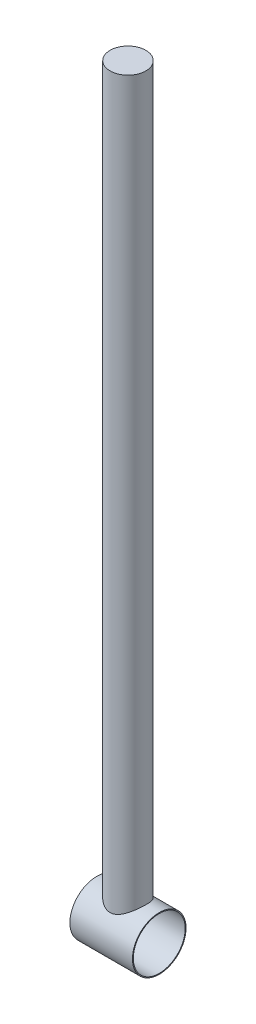
ISO-10303-21;
HEADER;
FILE_DESCRIPTION(('STEP AP214'),'2;1');
FILE_NAME('part.step','',(''),(''),'','','');
FILE_SCHEMA(('AUTOMOTIVE_DESIGN { 1 0 10303 214 1 1 1 1 }'));
ENDSEC;
DATA;
#1=APPLICATION_CONTEXT('core data for automotive mechanical design processes');
#2=APPLICATION_PROTOCOL_DEFINITION('international standard','automotive_design',2000,#1);
#3=PRODUCT_CONTEXT('',#1,'mechanical');
#4=PRODUCT('Part','Part','',(#3));
#5=PRODUCT_RELATED_PRODUCT_CATEGORY('part','',(#4));
#6=PRODUCT_DEFINITION_FORMATION('','',#4);
#7=PRODUCT_DEFINITION_CONTEXT('part definition',#1,'design');
#8=PRODUCT_DEFINITION('design','',#6,#7);
#9=PRODUCT_DEFINITION_SHAPE('','',#8);
#10=(LENGTH_UNIT() NAMED_UNIT(*) SI_UNIT(.MILLI.,.METRE.));
#11=(NAMED_UNIT(*) PLANE_ANGLE_UNIT() SI_UNIT($,.RADIAN.));
#12=(NAMED_UNIT(*) SI_UNIT($,.STERADIAN.) SOLID_ANGLE_UNIT());
#13=UNCERTAINTY_MEASURE_WITH_UNIT(LENGTH_MEASURE(1.E-05),#10,'distance_accuracy_value','');
#14=(GEOMETRIC_REPRESENTATION_CONTEXT(3) GLOBAL_UNCERTAINTY_ASSIGNED_CONTEXT((#13)) GLOBAL_UNIT_ASSIGNED_CONTEXT((#10,
#11,#12)) REPRESENTATION_CONTEXT('',''));
#15=CARTESIAN_POINT('',(0.,0.,0.));
#16=DIRECTION('',(0.,0.,1.));
#17=DIRECTION('',(1.,0.,0.));
#18=AXIS2_PLACEMENT_3D('',#15,#16,#17);
#19=CARTESIAN_POINT('',(35.,0.,0.));
#20=DIRECTION('',(1.,0.,0.));
#21=DIRECTION('',(0.,0.,-1.));
#22=AXIS2_PLACEMENT_3D('',#19,#20,#21);
#23=PLANE('',#22);
#24=CARTESIAN_POINT('',(35.,0.,0.));
#25=DIRECTION('',(1.,0.,0.));
#26=DIRECTION('',(0.,0.,-1.));
#27=AXIS2_PLACEMENT_3D('',#24,#25,#26);
#28=CIRCLE('',#27,30.);
#29=CARTESIAN_POINT('',(35.,0.,-30.));
#30=VERTEX_POINT('',#29);
#31=EDGE_CURVE('E10',#30,#30,#28,.T.);
#32=ORIENTED_EDGE('',*,*,#31,.T.);
#33=EDGE_LOOP('',(#32));
#34=FACE_BOUND('',#33,.T.);
#35=CARTESIAN_POINT('',(35.,0.,0.));
#36=DIRECTION('',(1.,0.,0.));
#37=DIRECTION('',(0.,0.,-1.));
#38=AXIS2_PLACEMENT_3D('',#35,#36,#37);
#39=CIRCLE('',#38,29.);
#40=CARTESIAN_POINT('',(35.,0.,-29.));
#41=VERTEX_POINT('',#40);
#42=EDGE_CURVE('E43',#41,#41,#39,.T.);
#43=ORIENTED_EDGE('',*,*,#42,.F.);
#44=EDGE_LOOP('',(#43));
#45=FACE_BOUND('',#44,.T.);
#46=ADVANCED_FACE('F32',(#34,#45),#23,.T.);
#47=CARTESIAN_POINT('',(-35.,0.,0.));
#48=DIRECTION('',(1.,0.,0.));
#49=DIRECTION('',(0.,0.,-1.));
#50=AXIS2_PLACEMENT_3D('',#47,#48,#49);
#51=PLANE('',#50);
#52=CARTESIAN_POINT('',(-35.,0.,0.));
#53=DIRECTION('',(1.,0.,0.));
#54=DIRECTION('',(0.,0.,-1.));
#55=AXIS2_PLACEMENT_3D('',#52,#53,#54);
#56=CIRCLE('',#55,30.);
#57=CARTESIAN_POINT('',(-35.,0.,-30.));
#58=VERTEX_POINT('',#57);
#59=EDGE_CURVE('E36',#58,#58,#56,.T.);
#60=ORIENTED_EDGE('',*,*,#59,.F.);
#61=EDGE_LOOP('',(#60));
#62=FACE_BOUND('',#61,.T.);
#63=CARTESIAN_POINT('',(-35.,0.,0.));
#64=DIRECTION('',(1.,0.,0.));
#65=DIRECTION('',(0.,0.,-1.));
#66=AXIS2_PLACEMENT_3D('',#63,#64,#65);
#67=CIRCLE('',#66,29.);
#68=CARTESIAN_POINT('',(-35.,0.,-29.));
#69=VERTEX_POINT('',#68);
#70=EDGE_CURVE('E45',#69,#69,#67,.T.);
#71=ORIENTED_EDGE('',*,*,#70,.T.);
#72=EDGE_LOOP('',(#71));
#73=FACE_BOUND('',#72,.T.);
#74=ADVANCED_FACE('F75',(#62,#73),#51,.F.);
#75=CARTESIAN_POINT('',(35.,0.,0.));
#76=DIRECTION('',(-1.,0.,0.));
#77=DIRECTION('',(0.,0.,1.));
#78=AXIS2_PLACEMENT_3D('',#75,#76,#77);
#79=CYLINDRICAL_SURFACE('',#78,30.);
#80=CARTESIAN_POINT('',(0.,22.3606797749979,20.));
#81=CARTESIAN_POINT('',(0.488208956169302,22.3606858935288,19.9999964119226));
#82=CARTESIAN_POINT('',(0.976468291774058,22.3767415723571,19.9820866285813));
#83=CARTESIAN_POINT('',(1.94835881250643,22.4401594085095,19.9108373861768));
#84=CARTESIAN_POINT('',(2.43198924712352,22.4875265581483,19.8574922772833));
#85=CARTESIAN_POINT('',(3.39112332136817,22.6113496939203,19.7163799196857));
#86=CARTESIAN_POINT('',(3.8666135294044,22.6878496694561,19.6285606101056));
#87=CARTESIAN_POINT('',(4.80533737323533,22.8665434498395,19.4200919600602));
#88=CARTESIAN_POINT('',(5.26857077190595,22.9687377513765,19.2994419849513));
#89=CARTESIAN_POINT('',(6.17578513914899,23.193728226989,19.0284426273943));
#90=CARTESIAN_POINT('',(6.6199111296105,23.3163108203906,18.8783985352891));
#91=CARTESIAN_POINT('',(7.49212487931457,23.5787801839215,18.5495380856482));
#92=CARTESIAN_POINT('',(7.92020999413462,23.7186697909934,18.3707170095788));
#93=CARTESIAN_POINT('',(8.75912421482544,24.0118255935988,17.9858478768931));
#94=CARTESIAN_POINT('',(9.16995442032433,24.1650909347959,17.7798015587787));
#95=CARTESIAN_POINT('',(9.97362051230805,24.4813525241294,17.3417522052945));
#96=CARTESIAN_POINT('',(10.3664551510918,24.644349445194,17.1097473739498));
#97=CARTESIAN_POINT('',(11.1932268211757,25.00257367896,16.5827611461459));
#98=CARTESIAN_POINT('',(11.6240409428177,25.1988679806497,16.2835985891376));
#99=CARTESIAN_POINT('',(12.4598274059487,25.5951544496233,15.6533280846079));
#100=CARTESIAN_POINT('',(12.8647979980787,25.7951468660549,15.3222179783466));
#101=CARTESIAN_POINT('',(13.6481434866574,26.194621993879,14.6288076134715));
#102=CARTESIAN_POINT('',(14.0264936382841,26.3941040691864,14.2664790139786));
#103=CARTESIAN_POINT('',(14.7548145893199,26.788258639696,13.5118632099609));
#104=CARTESIAN_POINT('',(15.1047834311923,26.9829308025026,13.1195739425843));
#105=CARTESIAN_POINT('',(15.8231340954399,27.3910931463656,12.2471310095378));
#106=CARTESIAN_POINT('',(16.1868495528045,27.6032288530363,11.7624780965832));
#107=CARTESIAN_POINT('',(16.8717372344808,28.0103500677694,10.7570654072488));
#108=CARTESIAN_POINT('',(17.1929043262227,28.2053335058183,10.2363012863295));
#109=CARTESIAN_POINT('',(17.7887598687195,28.5724511444835,9.1617184714881));
#110=CARTESIAN_POINT('',(18.0634871779264,28.7446044219641,8.60792794262454));
#111=CARTESIAN_POINT('',(18.5627727588207,29.0609568759301,7.4705384998476));
#112=CARTESIAN_POINT('',(18.7873417767955,29.205162039351,6.88694600391358));
#113=CARTESIAN_POINT('',(19.1602240381012,29.4464999554022,5.76165832972233));
#114=CARTESIAN_POINT('',(19.3142641521887,29.5470977395677,5.22260227045826));
#115=CARTESIAN_POINT('',(19.5772038937651,29.7196407127317,4.12906673821278));
#116=CARTESIAN_POINT('',(19.6861065662819,29.7915878345267,3.57458830833749));
#117=CARTESIAN_POINT('',(19.8566974647913,29.904587508942,2.45588842993637));
#118=CARTESIAN_POINT('',(19.9184351137685,29.9456724005222,1.89167781543662));
#119=CARTESIAN_POINT('',(19.9936647349202,29.9957633041667,0.7586590887696));
#120=CARTESIAN_POINT('',(20.007163514351,30.0047738424215,0.189851636642885));
#121=CARTESIAN_POINT('',(19.9873184370662,29.9915473981852,-0.859806415927934));
#122=CARTESIAN_POINT('',(19.9607940358833,29.9738593639155,-1.34086232409546));
#123=CARTESIAN_POINT('',(19.873310019839,29.9156709892741,-2.2983895351906));
#124=CARTESIAN_POINT('',(19.8123548499873,29.8751735935912,-2.7748614218412));
#125=CARTESIAN_POINT('',(19.6568520909165,29.7722764488344,-3.7198828753724));
#126=CARTESIAN_POINT('',(19.5623030441721,29.7098757494512,-4.18843209759108));
#127=CARTESIAN_POINT('',(19.3408382238798,29.5645234505635,-5.11455664152083));
#128=CARTESIAN_POINT('',(19.2139210515152,29.4815709628999,-5.57213148802944));
#129=CARTESIAN_POINT('',(18.9298040334638,29.2971987002846,-6.47179810816159));
#130=CARTESIAN_POINT('',(18.7727295883957,29.1958554904912,-6.91394533614488));
#131=CARTESIAN_POINT('',(18.4296096664266,28.9764235265008,-7.78251525709052));
#132=CARTESIAN_POINT('',(18.2435647019401,28.858335068488,-8.20893822800989));
#133=CARTESIAN_POINT('',(17.8441778455769,28.6075257726395,-9.04431763466509));
#134=CARTESIAN_POINT('',(17.6308352556287,28.4748045606182,-9.45327362336785));
#135=CARTESIAN_POINT('',(17.1784769804029,28.1969539999433,-10.2523545489443));
#136=CARTESIAN_POINT('',(16.9394582795807,28.0518231942476,-10.6424772661187));
#137=CARTESIAN_POINT('',(16.4042840153249,27.7317267401802,-11.4527356062426));
#138=CARTESIAN_POINT('',(16.1047473885238,27.5553463717531,-11.8700812163928));
#139=CARTESIAN_POINT('',(15.4767499308217,27.1930871485775,-12.6780149842778));
#140=CARTESIAN_POINT('',(15.1482869484778,27.007207587744,-13.0686011478891));
#141=CARTESIAN_POINT('',(14.463625347029,26.6292105400492,-13.8225619123957));
#142=CARTESIAN_POINT('',(14.107387635318,26.4370844912714,-14.185896693865));
#143=CARTESIAN_POINT('',(13.3689696755022,26.0505351068054,-14.883843396687));
#144=CARTESIAN_POINT('',(12.9867881329827,25.8561116568934,-15.2184538830105));
#145=CARTESIAN_POINT('',(12.1362208652914,25.4387487342262,-15.9077512722913));
#146=CARTESIAN_POINT('',(11.6636681752519,25.2160728404677,-16.2574779985587));
#147=CARTESIAN_POINT('',(10.6867448691347,24.7793365815512,-16.9156894234147));
#148=CARTESIAN_POINT('',(10.1823671315698,24.5652781624035,-17.2241648426867));
#149=CARTESIAN_POINT('',(9.14376134489059,24.1532936665152,-17.7972680129957));
#150=CARTESIAN_POINT('',(8.60957393087465,23.9553464914574,-18.0619535936899));
#151=CARTESIAN_POINT('',(7.78719238261373,23.6764424287916,-18.4241508744694));
#152=CARTESIAN_POINT('',(7.50958963683994,23.586488758667,-18.539064186288));
#153=CARTESIAN_POINT('',(6.94749503984161,23.4135888725702,-18.7569503816948));
#154=CARTESIAN_POINT('',(6.66300152644001,23.3306443694362,-18.8599203489511));
#155=CARTESIAN_POINT('',(5.96407091868975,23.1390114191645,-19.0949737019528));
#156=CARTESIAN_POINT('',(5.54626140545961,23.0345499403737,-19.2205883140043));
#157=CARTESIAN_POINT('',(4.69922231908342,22.8454014192454,-19.4450303060951));
#158=CARTESIAN_POINT('',(4.26999589657128,22.7607089831938,-19.5438649938583));
#159=CARTESIAN_POINT('',(3.40278811100768,22.6140815263718,-19.7133430846625));
#160=CARTESIAN_POINT('',(2.96482019952331,22.5521140132966,-19.78402675084));
#161=CARTESIAN_POINT('',(2.08233638909669,22.4531500088269,-19.8962732778957));
#162=CARTESIAN_POINT('',(1.63782046369869,22.4161536183507,-19.9378360210846));
#163=CARTESIAN_POINT('',(0.743602003114596,22.3685666502113,-19.9912114344644));
#164=CARTESIAN_POINT('',(0.293885240116605,22.3580932385861,-20.0028921020166));
#165=CARTESIAN_POINT('',(-0.605120297999129,22.3643493087133,-19.9958970388908));
#166=CARTESIAN_POINT('',(-1.05440907208809,22.3810788556911,-19.9772212354264));
#167=CARTESIAN_POINT('',(-1.9492428602337,22.4410353821841,-19.9098452800438));
#168=CARTESIAN_POINT('',(-2.39478497674719,22.4842812448844,-19.8611237313693));
#169=CARTESIAN_POINT('',(-3.27854030433162,22.5954993646352,-19.7344995148557));
#170=CARTESIAN_POINT('',(-3.71675339276235,22.6634720350192,-19.6565963592159));
#171=CARTESIAN_POINT('',(-4.56177482159982,22.8176625120601,-19.4773587360434));
#172=CARTESIAN_POINT('',(-4.9690663661839,22.9028156744357,-19.3773687153742));
#173=CARTESIAN_POINT('',(-5.7729769048643,23.0905696500378,-19.1532490632813));
#174=CARTESIAN_POINT('',(-6.16959170710487,23.193177203668,-19.0291101035355));
#175=CARTESIAN_POINT('',(-6.95065639455215,23.4130553221982,-18.7579126655137));
#176=CARTESIAN_POINT('',(-7.33510717762389,23.5303248016759,-18.6108558836455));
#177=CARTESIAN_POINT('',(-8.0910039230564,23.7768089487606,-18.2949037795793));
#178=CARTESIAN_POINT('',(-8.46244798787663,23.9060253493674,-18.1260052876392));
#179=CARTESIAN_POINT('',(-9.26453201163456,24.2005356466709,-17.731501269301));
#180=CARTESIAN_POINT('',(-9.69216720830649,24.3678787987211,-17.5013086005028));
#181=CARTESIAN_POINT('',(-10.5268797585094,24.7117489529602,-17.0123139239897));
#182=CARTESIAN_POINT('',(-10.9339551810086,24.8882768146534,-16.7535092362064));
#183=CARTESIAN_POINT('',(-11.7272393872389,25.246838016415,-16.2081390990384));
#184=CARTESIAN_POINT('',(-12.1134251136209,25.4288771074696,-15.9215439116551));
#185=CARTESIAN_POINT('',(-12.863686505644,25.7947122322757,-15.3217576930428));
#186=CARTESIAN_POINT('',(-13.2277606863969,25.9785083830645,-15.0085648790455));
#187=CARTESIAN_POINT('',(-14.010022924438,26.3845748584298,-14.2850209466698));
#188=CARTESIAN_POINT('',(-14.4226354817809,26.6064699077529,-13.868399953091));
#189=CARTESIAN_POINT('',(-15.2116275793937,27.0422910024591,-12.9981303927617));
#190=CARTESIAN_POINT('',(-15.5880004523266,27.2562155770218,-12.5444750407321));
#191=CARTESIAN_POINT('',(-16.3015809622043,27.6705120036506,-11.6020484650165));
#192=CARTESIAN_POINT('',(-16.6388155779588,27.8708931512095,-11.1133018111967));
#193=CARTESIAN_POINT('',(-17.2712189380549,28.2529916116302,-10.1024838029969));
#194=CARTESIAN_POINT('',(-17.5663989619658,28.4347139253593,-9.58042143890714));
#195=CARTESIAN_POINT('',(-18.0588559388184,28.7418292040784,-8.60898698059616));
#196=CARTESIAN_POINT('',(-18.2640476187588,28.871337394815,-8.16491313347023));
#197=CARTESIAN_POINT('',(-18.6427436665588,29.11237793097,-7.25872966066563));
#198=CARTESIAN_POINT('',(-18.8162516453839,29.2239123246767,-6.79662209756982));
#199=CARTESIAN_POINT('',(-19.1295452645597,29.4266077341683,-5.8570926543953));
#200=CARTESIAN_POINT('',(-19.2693535082187,29.5177824027246,-5.37968128385402));
#201=CARTESIAN_POINT('',(-19.5136219644057,29.6778186712604,-4.41219358714587));
#202=CARTESIAN_POINT('',(-19.6180816641359,29.746679947541,-3.92211707735807));
#203=CARTESIAN_POINT('',(-19.7905605262366,29.8607111976658,-2.93054121015943));
#204=CARTESIAN_POINT('',(-19.8584133272705,29.9057729947659,-2.42900032455899));
#205=CARTESIAN_POINT('',(-19.9559150035461,29.9706058238814,-1.42057881685205));
#206=CARTESIAN_POINT('',(-19.985563818304,29.990376815857,-0.913698186293017));
#207=CARTESIAN_POINT('',(-20.0061827922548,30.0041212399487,0.101169392531049));
#208=CARTESIAN_POINT('',(-19.9971552556599,29.9980962089087,0.6091562730871));
#209=CARTESIAN_POINT('',(-19.9405705458765,29.9604056252688,1.6219998853204));
#210=CARTESIAN_POINT('',(-19.8930151261764,29.9287412395721,2.12685675839747));
#211=CARTESIAN_POINT('',(-19.7649794259347,29.8437985658208,3.09279975247605));
#212=CARTESIAN_POINT('',(-19.687150146037,29.7922629250282,3.55439520403423));
#213=CARTESIAN_POINT('',(-19.5000321223317,29.6689450523963,4.46836902451358));
#214=CARTESIAN_POINT('',(-19.3907452072019,29.597163997457,4.92074792756969));
#215=CARTESIAN_POINT('',(-19.1419956701691,29.4347944617127,5.81367709229976));
#216=CARTESIAN_POINT('',(-19.0025311498945,29.344204797736,6.25422660786602));
#217=CARTESIAN_POINT('',(-18.6949126651676,29.1459419809342,7.12122590088722));
#218=CARTESIAN_POINT('',(-18.5267571866793,29.0382679265783,7.54767493283414));
#219=CARTESIAN_POINT('',(-18.1528283168397,28.8010951909527,8.40878779714676));
#220=CARTESIAN_POINT('',(-17.9454426246028,28.670694888708,8.84250227551099));
#221=CARTESIAN_POINT('',(-17.5022026754717,28.3953682076704,9.69029143409239));
#222=CARTESIAN_POINT('',(-17.2663476127158,28.2504414177065,10.104365557902));
#223=CARTESIAN_POINT('',(-16.7678351398796,27.9485407408145,10.9116855558948));
#224=CARTESIAN_POINT('',(-16.5051663004555,27.7915617237644,11.3049224388242));
#225=CARTESIAN_POINT('',(-15.9547049296104,27.4682178656632,12.0693531593152));
#226=CARTESIAN_POINT('',(-15.6669095826824,27.3018519735229,12.4405445187535));
#227=CARTESIAN_POINT('',(-15.0204704992175,26.9357159197241,13.2166207315212));
#228=CARTESIAN_POINT('',(-14.6578028483683,26.7348072575091,13.6176230440809));
#229=CARTESIAN_POINT('',(-13.9025385930368,26.3282976577339,14.3878567191196));
#230=CARTESIAN_POINT('',(-13.5099380886709,26.1226961112019,14.757083928306));
#231=CARTESIAN_POINT('',(-12.6960054650691,25.7111873767681,15.4629181005339));
#232=CARTESIAN_POINT('',(-12.2746525915669,25.5052800753153,15.7995010665117));
#233=CARTESIAN_POINT('',(-11.4046784566367,25.0981854077811,16.4385088149114));
#234=CARTESIAN_POINT('',(-10.9560598425279,24.8969975860907,16.7409369054171));
#235=CARTESIAN_POINT('',(-10.0678167363029,24.519622725546,17.288437587054));
#236=CARTESIAN_POINT('',(-9.63011792851659,24.3426994009277,17.536125801145));
#237=CARTESIAN_POINT('',(-8.7331555306482,24.0019984692107,17.9996334824726));
#238=CARTESIAN_POINT('',(-8.27389129214839,23.838221257784,18.2154519906584));
#239=CARTESIAN_POINT('',(-7.33576452239174,23.5290813254498,18.6130511835398));
#240=CARTESIAN_POINT('',(-6.8569347106357,23.3836894022856,18.7948860714089));
#241=CARTESIAN_POINT('',(-5.88083845965279,23.1163199010043,19.1227764985235));
#242=CARTESIAN_POINT('',(-5.38357708340433,22.9943359489798,19.268841780706));
#243=CARTESIAN_POINT('',(-4.4853911912487,22.802875861737,19.4947592055363));
#244=CARTESIAN_POINT('',(-4.08754467830019,22.7277543004783,19.5821115045836));
#245=CARTESIAN_POINT('',(-3.28415884670264,22.5970955375622,19.7327455746581));
#246=CARTESIAN_POINT('',(-2.8786207162801,22.541555336465,19.7960310323203));
#247=CARTESIAN_POINT('',(-2.06234621278792,22.4519236803042,19.8976315087765));
#248=CARTESIAN_POINT('',(-1.65161370745007,22.4178171262643,19.9359641063474));
#249=CARTESIAN_POINT('',(-0.827266419755447,22.3721912092578,19.9871514199303));
#250=CARTESIAN_POINT('',(-0.413651293298562,22.3606745908688,20.0000030401181));
#251=CARTESIAN_POINT('',(0.,22.3606797749979,20.));
#252=B_SPLINE_CURVE_WITH_KNOTS('',3,(#80,#81,#82,#83,#84,#85,#86,#87,#88,#89,#90,#91,#92,#93,
#94,#95,#96,#97,#98,#99,#100,#101,#102,#103,#104,#105,#106,#107,#108,#109,#110,#111,#112,#113,
#114,#115,#116,#117,#118,#119,#120,#121,#122,#123,#124,#125,#126,#127,#128,#129,#130,#131,#132,
#133,#134,#135,#136,#137,#138,#139,#140,#141,#142,#143,#144,#145,#146,#147,#148,#149,#150,#151,
#152,#153,#154,#155,#156,#157,#158,#159,#160,#161,#162,#163,#164,#165,#166,#167,#168,#169,#170,
#171,#172,#173,#174,#175,#176,#177,#178,#179,#180,#181,#182,#183,#184,#185,#186,#187,#188,#189,
#190,#191,#192,#193,#194,#195,#196,#197,#198,#199,#200,#201,#202,#203,#204,#205,#206,#207,#208,
#209,#210,#211,#212,#213,#214,#215,#216,#217,#218,#219,#220,#221,#222,#223,#224,#225,#226,#227,
#228,#229,#230,#231,#232,#233,#234,#235,#236,#237,#238,#239,#240,#241,#242,#243,#244,#245,#246,
#247,#248,#249,#250,#251),.UNSPECIFIED.,.T.,.F.,(4,2,2,2,2,2,2,2,2,2,2,2,2,2,2,2,2,2,2,2,2,2,2,
2,2,2,2,2,2,2,2,2,2,2,2,2,2,2,2,2,2,2,2,2,2,2,2,2,2,2,2,2,2,2,2,2,2,2,2,2,2,2,2,2,2,2,2,2,2,2,2,
2,2,2,2,2,2,2,2,2,2,2,2,2,2,4),(0.,1.46413383476119,2.92850116798433,4.3950884612604,
5.86170410688106,7.31382579475252,8.76618582863999,10.2184531650402,11.6708210407287,
13.3493094048912,15.0279112663608,16.7080533902126,18.3883112996803,20.3117642438544,
22.2354490015051,24.1575160629544,26.079170930532,27.7853619359246,29.4914378208096,
31.1957234922769,32.8997686529781,34.3443503382155,35.7887455706705,37.2332034782288,
38.6777238198782,40.1163627603301,41.5549762578204,42.9936265517613,44.4324459938663,
46.0602839475324,47.6882430766068,49.3185364037738,50.9489111309836,52.8326361759336,
54.7167842470655,56.5984238649026,57.5389749114896,58.4797551409555,59.8242529017226,
61.1683834046849,62.5105844944299,63.8527910085193,65.2009164973756,66.5490452186684,
67.8981351058559,69.2472475454816,70.529851328563,71.8129515469024,73.0959568335221,
74.3791485235474,75.9187799981372,77.4585558113539,78.999997879572,80.5415433482356,
82.4201756779315,84.2991529785491,86.1768272700558,88.053996993814,89.5706110260009,
91.0870521029024,92.6024732144332,94.1179163090846,95.6401895843999,97.1624652697504,
98.6846502640925,100.206765984357,101.617993966733,103.029139928947,104.440374687427,
105.851683940514,107.344548709883,108.837455746597,110.331001811733,111.824715448892,
113.553354854051,115.282219865862,117.012346298594,118.742305015278,120.340261559248,
121.93826618052,123.53369984988,125.128698469926,126.370149556428,127.611410396842,
128.851795845449,130.092331986087),.UNSPECIFIED.);
#253=CARTESIAN_POINT('',(0.,22.3606797749979,20.));
#254=VERTEX_POINT('',#253);
#255=EDGE_CURVE('E48',#254,#254,#252,.T.);
#256=ORIENTED_EDGE('',*,*,#255,.F.);
#257=EDGE_LOOP('',(#256));
#258=FACE_BOUND('',#257,.T.);
#259=ORIENTED_EDGE('',*,*,#31,.F.);
#260=EDGE_LOOP('',(#259));
#261=FACE_BOUND('',#260,.T.);
#262=ORIENTED_EDGE('',*,*,#59,.T.);
#263=EDGE_LOOP('',(#262));
#264=FACE_BOUND('',#263,.T.);
#265=ADVANCED_FACE('F34',(#258,#261,#264),#79,.T.);
#266=CARTESIAN_POINT('',(35.,0.,0.));
#267=DIRECTION('',(-1.,0.,0.));
#268=DIRECTION('',(0.,0.,1.));
#269=AXIS2_PLACEMENT_3D('',#266,#267,#268);
#270=CYLINDRICAL_SURFACE('',#269,29.);
#271=ORIENTED_EDGE('',*,*,#42,.T.);
#272=EDGE_LOOP('',(#271));
#273=FACE_BOUND('',#272,.T.);
#274=ORIENTED_EDGE('',*,*,#70,.F.);
#275=EDGE_LOOP('',(#274));
#276=FACE_BOUND('',#275,.T.);
#277=ADVANCED_FACE('F65',(#273,#276),#270,.F.);
#278=CARTESIAN_POINT('',(0.,838.,0.));
#279=DIRECTION('',(0.,1.,0.));
#280=DIRECTION('',(0.,0.,1.));
#281=AXIS2_PLACEMENT_3D('',#278,#279,#280);
#282=PLANE('',#281);
#283=CARTESIAN_POINT('',(0.,838.,0.));
#284=DIRECTION('',(0.,1.,0.));
#285=DIRECTION('',(0.,0.,1.));
#286=AXIS2_PLACEMENT_3D('',#283,#284,#285);
#287=CIRCLE('',#286,20.);
#288=CARTESIAN_POINT('',(0.,838.,20.));
#289=VERTEX_POINT('',#288);
#290=EDGE_CURVE('E57',#289,#289,#287,.T.);
#291=ORIENTED_EDGE('',*,*,#290,.T.);
#292=EDGE_LOOP('',(#291));
#293=FACE_BOUND('',#292,.T.);
#294=ADVANCED_FACE('F63',(#293),#282,.T.);
#295=CARTESIAN_POINT('',(0.,-30.0010000000001,0.));
#296=DIRECTION('',(0.,1.,0.));
#297=DIRECTION('',(0.,0.,1.));
#298=AXIS2_PLACEMENT_3D('',#295,#296,#297);
#299=CYLINDRICAL_SURFACE('',#298,20.);
#300=ORIENTED_EDGE('',*,*,#290,.F.);
#301=EDGE_LOOP('',(#300));
#302=FACE_BOUND('',#301,.T.);
#303=ORIENTED_EDGE('',*,*,#255,.T.);
#304=EDGE_LOOP('',(#303));
#305=FACE_BOUND('',#304,.T.);
#306=ADVANCED_FACE('F58',(#302,#305),#299,.T.);
#307=CLOSED_SHELL('',(#46,#74,#265,#277,#294,#306));
#308=MANIFOLD_SOLID_BREP('B2',#307);
#309=ADVANCED_BREP_SHAPE_REPRESENTATION('',(#18,#308),#14);
#310=SHAPE_DEFINITION_REPRESENTATION(#9,#309);
ENDSEC;
END-ISO-10303-21;
